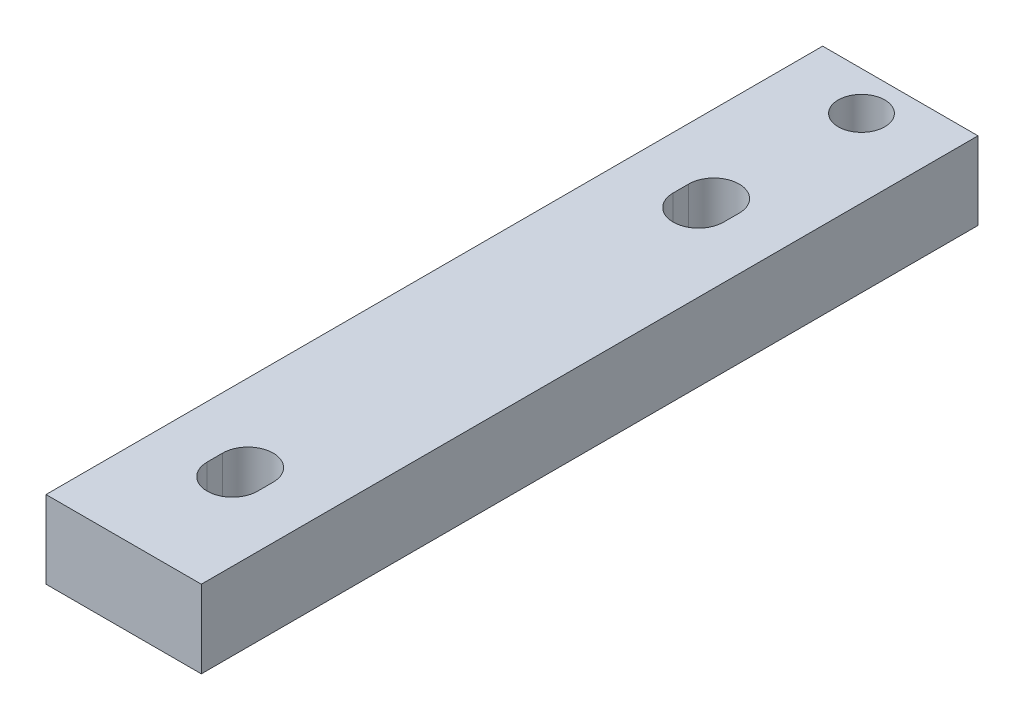
ISO-10303-21;
HEADER;
FILE_DESCRIPTION(('STEP AP214'),'2;1');
FILE_NAME('part.step','',(''),(''),'','','');
FILE_SCHEMA(('AUTOMOTIVE_DESIGN { 1 0 10303 214 1 1 1 1 }'));
ENDSEC;
DATA;
#1=APPLICATION_CONTEXT('core data for automotive mechanical design processes');
#2=APPLICATION_PROTOCOL_DEFINITION('international standard','automotive_design',2000,#1);
#3=PRODUCT_CONTEXT('',#1,'mechanical');
#4=PRODUCT('Part','Part','',(#3));
#5=PRODUCT_RELATED_PRODUCT_CATEGORY('part','',(#4));
#6=PRODUCT_DEFINITION_FORMATION('','',#4);
#7=PRODUCT_DEFINITION_CONTEXT('part definition',#1,'design');
#8=PRODUCT_DEFINITION('design','',#6,#7);
#9=PRODUCT_DEFINITION_SHAPE('','',#8);
#10=(LENGTH_UNIT() NAMED_UNIT(*) SI_UNIT(.MILLI.,.METRE.));
#11=(NAMED_UNIT(*) PLANE_ANGLE_UNIT() SI_UNIT($,.RADIAN.));
#12=(NAMED_UNIT(*) SI_UNIT($,.STERADIAN.) SOLID_ANGLE_UNIT());
#13=UNCERTAINTY_MEASURE_WITH_UNIT(LENGTH_MEASURE(1.E-05),#10,'distance_accuracy_value','');
#14=(GEOMETRIC_REPRESENTATION_CONTEXT(3) GLOBAL_UNCERTAINTY_ASSIGNED_CONTEXT((#13)) GLOBAL_UNIT_ASSIGNED_CONTEXT((#10,
#11,#12)) REPRESENTATION_CONTEXT('',''));
#15=CARTESIAN_POINT('',(0.,0.,0.));
#16=DIRECTION('',(0.,0.,1.));
#17=DIRECTION('',(1.,0.,0.));
#18=AXIS2_PLACEMENT_3D('',#15,#16,#17);
#19=CARTESIAN_POINT('',(0.,10.,0.));
#20=DIRECTION('',(0.,-1.,0.));
#21=DIRECTION('',(0.,0.,-1.));
#22=AXIS2_PLACEMENT_3D('',#19,#20,#21);
#23=PLANE('',#22);
#24=CARTESIAN_POINT('',(0.,10.,-24.));
#25=DIRECTION('',(0.,1.,0.));
#26=DIRECTION('',(0.,0.,1.));
#27=AXIS2_PLACEMENT_3D('',#24,#25,#26);
#28=CIRCLE('',#27,3.25);
#29=CARTESIAN_POINT('',(-3.25,10.,-24.));
#30=VERTEX_POINT('',#29);
#31=CARTESIAN_POINT('',(3.25,10.,-24.));
#32=VERTEX_POINT('',#31);
#33=EDGE_CURVE('E162',#30,#32,#28,.T.);
#34=ORIENTED_EDGE('',*,*,#33,.F.);
#35=DIRECTION('',(0.,0.,1.));
#36=VECTOR('',#35,1.);
#37=CARTESIAN_POINT('',(-3.25,10.,-24.));
#38=LINE('',#37,#36);
#39=CARTESIAN_POINT('',(-3.25,10.,-26.));
#40=VERTEX_POINT('',#39);
#41=EDGE_CURVE('E170',#40,#30,#38,.T.);
#42=ORIENTED_EDGE('',*,*,#41,.F.);
#43=CARTESIAN_POINT('',(0.,10.,-26.));
#44=DIRECTION('',(0.,1.,0.));
#45=DIRECTION('',(0.,0.,1.));
#46=AXIS2_PLACEMENT_3D('',#43,#44,#45);
#47=CIRCLE('',#46,3.25);
#48=CARTESIAN_POINT('',(3.25,10.,-26.));
#49=VERTEX_POINT('',#48);
#50=EDGE_CURVE('E167',#49,#40,#47,.T.);
#51=ORIENTED_EDGE('',*,*,#50,.F.);
#52=DIRECTION('',(0.,0.,-1.));
#53=VECTOR('',#52,1.);
#54=CARTESIAN_POINT('',(3.25,10.,-24.));
#55=LINE('',#54,#53);
#56=EDGE_CURVE('E164',#32,#49,#55,.T.);
#57=ORIENTED_EDGE('',*,*,#56,.F.);
#58=EDGE_LOOP('',(#34,#42,#51,#57));
#59=FACE_BOUND('',#58,.T.);
#60=DIRECTION('',(0.,0.,-1.));
#61=VECTOR('',#60,1.);
#62=CARTESIAN_POINT('',(10.,10.,50.));
#63=LINE('',#62,#61);
#64=CARTESIAN_POINT('',(10.,10.,50.));
#65=VERTEX_POINT('',#64);
#66=CARTESIAN_POINT('',(10.,10.,-50.));
#67=VERTEX_POINT('',#66);
#68=EDGE_CURVE('E199',#65,#67,#63,.T.);
#69=ORIENTED_EDGE('',*,*,#68,.T.);
#70=DIRECTION('',(-1.,0.,0.));
#71=VECTOR('',#70,1.);
#72=CARTESIAN_POINT('',(-10.,10.,-50.));
#73=LINE('',#72,#71);
#74=CARTESIAN_POINT('',(-10.,10.,-50.));
#75=VERTEX_POINT('',#74);
#76=EDGE_CURVE('E202',#67,#75,#73,.T.);
#77=ORIENTED_EDGE('',*,*,#76,.T.);
#78=DIRECTION('',(0.,0.,1.));
#79=VECTOR('',#78,1.);
#80=CARTESIAN_POINT('',(-10.,10.,50.));
#81=LINE('',#80,#79);
#82=CARTESIAN_POINT('',(-10.,10.,50.));
#83=VERTEX_POINT('',#82);
#84=EDGE_CURVE('E205',#75,#83,#81,.T.);
#85=ORIENTED_EDGE('',*,*,#84,.T.);
#86=DIRECTION('',(1.,0.,0.));
#87=VECTOR('',#86,1.);
#88=CARTESIAN_POINT('',(-10.,10.,50.));
#89=LINE('',#88,#87);
#90=EDGE_CURVE('E207',#83,#65,#89,.T.);
#91=ORIENTED_EDGE('',*,*,#90,.T.);
#92=EDGE_LOOP('',(#69,#77,#85,#91));
#93=FACE_BOUND('',#92,.T.);
#94=CARTESIAN_POINT('',(0.,10.,-45.));
#95=DIRECTION('',(0.,1.,0.));
#96=DIRECTION('',(0.,0.,1.));
#97=AXIS2_PLACEMENT_3D('',#94,#95,#96);
#98=CIRCLE('',#97,3.);
#99=CARTESIAN_POINT('',(0.,10.,-42.));
#100=VERTEX_POINT('',#99);
#101=EDGE_CURVE('E193',#100,#100,#98,.T.);
#102=ORIENTED_EDGE('',*,*,#101,.F.);
#103=EDGE_LOOP('',(#102));
#104=FACE_BOUND('',#103,.T.);
#105=CARTESIAN_POINT('',(0.,10.,36.));
#106=DIRECTION('',(0.,1.,0.));
#107=DIRECTION('',(0.,0.,1.));
#108=AXIS2_PLACEMENT_3D('',#105,#106,#107);
#109=CIRCLE('',#108,3.25);
#110=CARTESIAN_POINT('',(-3.25,10.,36.));
#111=VERTEX_POINT('',#110);
#112=CARTESIAN_POINT('',(3.25,10.,36.));
#113=VERTEX_POINT('',#112);
#114=EDGE_CURVE('E126',#111,#113,#109,.T.);
#115=ORIENTED_EDGE('',*,*,#114,.F.);
#116=DIRECTION('',(0.,0.,1.));
#117=VECTOR('',#116,1.);
#118=CARTESIAN_POINT('',(-3.25,10.,36.));
#119=LINE('',#118,#117);
#120=CARTESIAN_POINT('',(-3.25,10.,34.));
#121=VERTEX_POINT('',#120);
#122=EDGE_CURVE('E148',#121,#111,#119,.T.);
#123=ORIENTED_EDGE('',*,*,#122,.F.);
#124=CARTESIAN_POINT('',(0.,10.,34.));
#125=DIRECTION('',(0.,1.,0.));
#126=DIRECTION('',(0.,0.,1.));
#127=AXIS2_PLACEMENT_3D('',#124,#125,#126);
#128=CIRCLE('',#127,3.25);
#129=CARTESIAN_POINT('',(3.25,10.,34.));
#130=VERTEX_POINT('',#129);
#131=EDGE_CURVE('E146',#130,#121,#128,.T.);
#132=ORIENTED_EDGE('',*,*,#131,.F.);
#133=DIRECTION('',(0.,0.,-1.));
#134=VECTOR('',#133,1.);
#135=CARTESIAN_POINT('',(3.25,10.,36.));
#136=LINE('',#135,#134);
#137=EDGE_CURVE('E134',#113,#130,#136,.T.);
#138=ORIENTED_EDGE('',*,*,#137,.F.);
#139=EDGE_LOOP('',(#115,#123,#132,#138));
#140=FACE_BOUND('',#139,.T.);
#141=ADVANCED_FACE('F37',(#59,#93,#104,#140),#23,.F.);
#142=CARTESIAN_POINT('',(0.,0.,0.));
#143=DIRECTION('',(0.,-1.,0.));
#144=DIRECTION('',(0.,0.,-1.));
#145=AXIS2_PLACEMENT_3D('',#142,#143,#144);
#146=PLANE('',#145);
#147=DIRECTION('',(0.,0.,-1.));
#148=VECTOR('',#147,1.);
#149=CARTESIAN_POINT('',(10.,0.,50.));
#150=LINE('',#149,#148);
#151=CARTESIAN_POINT('',(10.,0.,50.));
#152=VERTEX_POINT('',#151);
#153=CARTESIAN_POINT('',(10.,0.,-50.));
#154=VERTEX_POINT('',#153);
#155=EDGE_CURVE('E196',#152,#154,#150,.T.);
#156=ORIENTED_EDGE('',*,*,#155,.F.);
#157=DIRECTION('',(1.,0.,0.));
#158=VECTOR('',#157,1.);
#159=CARTESIAN_POINT('',(-10.,0.,50.));
#160=LINE('',#159,#158);
#161=CARTESIAN_POINT('',(-10.,0.,50.));
#162=VERTEX_POINT('',#161);
#163=EDGE_CURVE('E203',#162,#152,#160,.T.);
#164=ORIENTED_EDGE('',*,*,#163,.F.);
#165=DIRECTION('',(0.,0.,1.));
#166=VECTOR('',#165,1.);
#167=CARTESIAN_POINT('',(-10.,0.,50.));
#168=LINE('',#167,#166);
#169=CARTESIAN_POINT('',(-10.,0.,-50.));
#170=VERTEX_POINT('',#169);
#171=EDGE_CURVE('E214',#170,#162,#168,.T.);
#172=ORIENTED_EDGE('',*,*,#171,.F.);
#173=DIRECTION('',(-1.,0.,0.));
#174=VECTOR('',#173,1.);
#175=CARTESIAN_POINT('',(-10.,0.,-50.));
#176=LINE('',#175,#174);
#177=EDGE_CURVE('E212',#154,#170,#176,.T.);
#178=ORIENTED_EDGE('',*,*,#177,.F.);
#179=EDGE_LOOP('',(#156,#164,#172,#178));
#180=FACE_BOUND('',#179,.T.);
#181=CARTESIAN_POINT('',(0.,0.,-45.));
#182=DIRECTION('',(0.,1.,0.));
#183=DIRECTION('',(0.,0.,1.));
#184=AXIS2_PLACEMENT_3D('',#181,#182,#183);
#185=CIRCLE('',#184,3.);
#186=CARTESIAN_POINT('',(0.,0.,-42.));
#187=VERTEX_POINT('',#186);
#188=EDGE_CURVE('E192',#187,#187,#185,.T.);
#189=ORIENTED_EDGE('',*,*,#188,.T.);
#190=EDGE_LOOP('',(#189));
#191=FACE_BOUND('',#190,.T.);
#192=DIRECTION('',(0.,0.,1.));
#193=VECTOR('',#192,1.);
#194=CARTESIAN_POINT('',(-3.25,0.,-24.));
#195=LINE('',#194,#193);
#196=CARTESIAN_POINT('',(-3.25,0.,-26.));
#197=VERTEX_POINT('',#196);
#198=CARTESIAN_POINT('',(-3.25,0.,-24.));
#199=VERTEX_POINT('',#198);
#200=EDGE_CURVE('E165',#197,#199,#195,.T.);
#201=ORIENTED_EDGE('',*,*,#200,.T.);
#202=CARTESIAN_POINT('',(0.,0.,-24.));
#203=DIRECTION('',(0.,1.,0.));
#204=DIRECTION('',(0.,0.,1.));
#205=AXIS2_PLACEMENT_3D('',#202,#203,#204);
#206=CIRCLE('',#205,3.25);
#207=CARTESIAN_POINT('',(3.25,0.,-24.));
#208=VERTEX_POINT('',#207);
#209=EDGE_CURVE('E142',#199,#208,#206,.T.);
#210=ORIENTED_EDGE('',*,*,#209,.T.);
#211=DIRECTION('',(0.,0.,-1.));
#212=VECTOR('',#211,1.);
#213=CARTESIAN_POINT('',(3.25,0.,-24.));
#214=LINE('',#213,#212);
#215=CARTESIAN_POINT('',(3.25,0.,-26.));
#216=VERTEX_POINT('',#215);
#217=EDGE_CURVE('E175',#208,#216,#214,.T.);
#218=ORIENTED_EDGE('',*,*,#217,.T.);
#219=CARTESIAN_POINT('',(0.,0.,-26.));
#220=DIRECTION('',(0.,1.,0.));
#221=DIRECTION('',(0.,0.,1.));
#222=AXIS2_PLACEMENT_3D('',#219,#220,#221);
#223=CIRCLE('',#222,3.25);
#224=EDGE_CURVE('E178',#216,#197,#223,.T.);
#225=ORIENTED_EDGE('',*,*,#224,.T.);
#226=EDGE_LOOP('',(#201,#210,#218,#225));
#227=FACE_BOUND('',#226,.T.);
#228=DIRECTION('',(0.,0.,1.));
#229=VECTOR('',#228,1.);
#230=CARTESIAN_POINT('',(-3.25,0.,36.));
#231=LINE('',#230,#229);
#232=CARTESIAN_POINT('',(-3.25,0.,34.));
#233=VERTEX_POINT('',#232);
#234=CARTESIAN_POINT('',(-3.25,0.,36.));
#235=VERTEX_POINT('',#234);
#236=EDGE_CURVE('E135',#233,#235,#231,.T.);
#237=ORIENTED_EDGE('',*,*,#236,.T.);
#238=CARTESIAN_POINT('',(0.,0.,36.));
#239=DIRECTION('',(0.,1.,0.));
#240=DIRECTION('',(0.,0.,1.));
#241=AXIS2_PLACEMENT_3D('',#238,#239,#240);
#242=CIRCLE('',#241,3.25);
#243=CARTESIAN_POINT('',(3.25,0.,36.));
#244=VERTEX_POINT('',#243);
#245=EDGE_CURVE('E60',#235,#244,#242,.T.);
#246=ORIENTED_EDGE('',*,*,#245,.T.);
#247=DIRECTION('',(0.,0.,-1.));
#248=VECTOR('',#247,1.);
#249=CARTESIAN_POINT('',(3.25,0.,36.));
#250=LINE('',#249,#248);
#251=CARTESIAN_POINT('',(3.25,0.,34.));
#252=VERTEX_POINT('',#251);
#253=EDGE_CURVE('E141',#244,#252,#250,.T.);
#254=ORIENTED_EDGE('',*,*,#253,.T.);
#255=CARTESIAN_POINT('',(0.,0.,34.));
#256=DIRECTION('',(0.,1.,0.));
#257=DIRECTION('',(0.,0.,1.));
#258=AXIS2_PLACEMENT_3D('',#255,#256,#257);
#259=CIRCLE('',#258,3.25);
#260=EDGE_CURVE('E154',#252,#233,#259,.T.);
#261=ORIENTED_EDGE('',*,*,#260,.T.);
#262=EDGE_LOOP('',(#237,#246,#254,#261));
#263=FACE_BOUND('',#262,.T.);
#264=ADVANCED_FACE('F232',(#180,#191,#227,#263),#146,.T.);
#265=CARTESIAN_POINT('',(10.,10.,50.));
#266=DIRECTION('',(-1.,0.,0.));
#267=DIRECTION('',(0.,0.,1.));
#268=AXIS2_PLACEMENT_3D('',#265,#266,#267);
#269=PLANE('',#268);
#270=ORIENTED_EDGE('',*,*,#155,.T.);
#271=DIRECTION('',(0.,-1.,0.));
#272=VECTOR('',#271,1.);
#273=CARTESIAN_POINT('',(10.,10.,-50.));
#274=LINE('',#273,#272);
#275=EDGE_CURVE('E11',#67,#154,#274,.T.);
#276=ORIENTED_EDGE('',*,*,#275,.F.);
#277=ORIENTED_EDGE('',*,*,#68,.F.);
#278=DIRECTION('',(0.,-1.,0.));
#279=VECTOR('',#278,1.);
#280=CARTESIAN_POINT('',(10.,10.,50.));
#281=LINE('',#280,#279);
#282=EDGE_CURVE('E209',#65,#152,#281,.T.);
#283=ORIENTED_EDGE('',*,*,#282,.T.);
#284=EDGE_LOOP('',(#270,#276,#277,#283));
#285=FACE_BOUND('',#284,.T.);
#286=ADVANCED_FACE('F39',(#285),#269,.F.);
#287=CARTESIAN_POINT('',(-10.,10.,-50.));
#288=DIRECTION('',(0.,0.,1.));
#289=DIRECTION('',(1.,0.,0.));
#290=AXIS2_PLACEMENT_3D('',#287,#288,#289);
#291=PLANE('',#290);
#292=ORIENTED_EDGE('',*,*,#177,.T.);
#293=DIRECTION('',(0.,-1.,0.));
#294=VECTOR('',#293,1.);
#295=CARTESIAN_POINT('',(-10.,10.,-50.));
#296=LINE('',#295,#294);
#297=EDGE_CURVE('E45',#75,#170,#296,.T.);
#298=ORIENTED_EDGE('',*,*,#297,.F.);
#299=ORIENTED_EDGE('',*,*,#76,.F.);
#300=ORIENTED_EDGE('',*,*,#275,.T.);
#301=EDGE_LOOP('',(#292,#298,#299,#300));
#302=FACE_BOUND('',#301,.T.);
#303=ADVANCED_FACE('F243',(#302),#291,.F.);
#304=CARTESIAN_POINT('',(-10.,10.,50.));
#305=DIRECTION('',(1.,0.,0.));
#306=DIRECTION('',(0.,0.,-1.));
#307=AXIS2_PLACEMENT_3D('',#304,#305,#306);
#308=PLANE('',#307);
#309=ORIENTED_EDGE('',*,*,#171,.T.);
#310=DIRECTION('',(0.,-1.,0.));
#311=VECTOR('',#310,1.);
#312=CARTESIAN_POINT('',(-10.,10.,50.));
#313=LINE('',#312,#311);
#314=EDGE_CURVE('E219',#83,#162,#313,.T.);
#315=ORIENTED_EDGE('',*,*,#314,.F.);
#316=ORIENTED_EDGE('',*,*,#84,.F.);
#317=ORIENTED_EDGE('',*,*,#297,.T.);
#318=EDGE_LOOP('',(#309,#315,#316,#317));
#319=FACE_BOUND('',#318,.T.);
#320=ADVANCED_FACE('F226',(#319),#308,.F.);
#321=CARTESIAN_POINT('',(-10.,10.,50.));
#322=DIRECTION('',(0.,0.,-1.));
#323=DIRECTION('',(-1.,0.,0.));
#324=AXIS2_PLACEMENT_3D('',#321,#322,#323);
#325=PLANE('',#324);
#326=ORIENTED_EDGE('',*,*,#163,.T.);
#327=ORIENTED_EDGE('',*,*,#282,.F.);
#328=ORIENTED_EDGE('',*,*,#90,.F.);
#329=ORIENTED_EDGE('',*,*,#314,.T.);
#330=EDGE_LOOP('',(#326,#327,#328,#329));
#331=FACE_BOUND('',#330,.T.);
#332=ADVANCED_FACE('F236',(#331),#325,.F.);
#333=CARTESIAN_POINT('',(0.,10.,-45.));
#334=DIRECTION('',(0.,-1.,0.));
#335=DIRECTION('',(0.,0.,-1.));
#336=AXIS2_PLACEMENT_3D('',#333,#334,#335);
#337=CYLINDRICAL_SURFACE('',#336,3.);
#338=ORIENTED_EDGE('',*,*,#101,.T.);
#339=EDGE_LOOP('',(#338));
#340=FACE_BOUND('',#339,.T.);
#341=ORIENTED_EDGE('',*,*,#188,.F.);
#342=EDGE_LOOP('',(#341));
#343=FACE_BOUND('',#342,.T.);
#344=ADVANCED_FACE('F259',(#340,#343),#337,.F.);
#345=CARTESIAN_POINT('',(0.,10.,-24.));
#346=DIRECTION('',(0.,-1.,0.));
#347=DIRECTION('',(0.,0.,-1.));
#348=AXIS2_PLACEMENT_3D('',#345,#346,#347);
#349=CYLINDRICAL_SURFACE('',#348,3.25);
#350=ORIENTED_EDGE('',*,*,#209,.F.);
#351=DIRECTION('',(0.,-1.,0.));
#352=VECTOR('',#351,1.);
#353=CARTESIAN_POINT('',(-3.25,10.,-24.));
#354=LINE('',#353,#352);
#355=EDGE_CURVE('E172',#30,#199,#354,.T.);
#356=ORIENTED_EDGE('',*,*,#355,.F.);
#357=ORIENTED_EDGE('',*,*,#33,.T.);
#358=DIRECTION('',(0.,-1.,0.));
#359=VECTOR('',#358,1.);
#360=CARTESIAN_POINT('',(3.25,10.,-24.));
#361=LINE('',#360,#359);
#362=EDGE_CURVE('E189',#32,#208,#361,.T.);
#363=ORIENTED_EDGE('',*,*,#362,.T.);
#364=EDGE_LOOP('',(#350,#356,#357,#363));
#365=FACE_BOUND('',#364,.T.);
#366=ADVANCED_FACE('F266',(#365),#349,.F.);
#367=CARTESIAN_POINT('',(3.25,10.,-24.));
#368=DIRECTION('',(-1.,0.,0.));
#369=DIRECTION('',(0.,0.,1.));
#370=AXIS2_PLACEMENT_3D('',#367,#368,#369);
#371=PLANE('',#370);
#372=ORIENTED_EDGE('',*,*,#217,.F.);
#373=ORIENTED_EDGE('',*,*,#362,.F.);
#374=ORIENTED_EDGE('',*,*,#56,.T.);
#375=DIRECTION('',(0.,-1.,0.));
#376=VECTOR('',#375,1.);
#377=CARTESIAN_POINT('',(3.25,10.,-26.));
#378=LINE('',#377,#376);
#379=EDGE_CURVE('E187',#49,#216,#378,.T.);
#380=ORIENTED_EDGE('',*,*,#379,.T.);
#381=EDGE_LOOP('',(#372,#373,#374,#380));
#382=FACE_BOUND('',#381,.T.);
#383=ADVANCED_FACE('F271',(#382),#371,.T.);
#384=CARTESIAN_POINT('',(0.,10.,-26.));
#385=DIRECTION('',(0.,-1.,0.));
#386=DIRECTION('',(0.,0.,-1.));
#387=AXIS2_PLACEMENT_3D('',#384,#385,#386);
#388=CYLINDRICAL_SURFACE('',#387,3.25);
#389=ORIENTED_EDGE('',*,*,#224,.F.);
#390=ORIENTED_EDGE('',*,*,#379,.F.);
#391=ORIENTED_EDGE('',*,*,#50,.T.);
#392=DIRECTION('',(0.,-1.,0.));
#393=VECTOR('',#392,1.);
#394=CARTESIAN_POINT('',(-3.25,10.,-26.));
#395=LINE('',#394,#393);
#396=EDGE_CURVE('E185',#40,#197,#395,.T.);
#397=ORIENTED_EDGE('',*,*,#396,.T.);
#398=EDGE_LOOP('',(#389,#390,#391,#397));
#399=FACE_BOUND('',#398,.T.);
#400=ADVANCED_FACE('F297',(#399),#388,.F.);
#401=CARTESIAN_POINT('',(-3.25,10.,-24.));
#402=DIRECTION('',(1.,0.,0.));
#403=DIRECTION('',(0.,0.,-1.));
#404=AXIS2_PLACEMENT_3D('',#401,#402,#403);
#405=PLANE('',#404);
#406=ORIENTED_EDGE('',*,*,#200,.F.);
#407=ORIENTED_EDGE('',*,*,#396,.F.);
#408=ORIENTED_EDGE('',*,*,#41,.T.);
#409=ORIENTED_EDGE('',*,*,#355,.T.);
#410=EDGE_LOOP('',(#406,#407,#408,#409));
#411=FACE_BOUND('',#410,.T.);
#412=ADVANCED_FACE('F294',(#411),#405,.T.);
#413=CARTESIAN_POINT('',(0.,10.,36.));
#414=DIRECTION('',(0.,-1.,0.));
#415=DIRECTION('',(0.,0.,-1.));
#416=AXIS2_PLACEMENT_3D('',#413,#414,#415);
#417=CYLINDRICAL_SURFACE('',#416,3.25);
#418=ORIENTED_EDGE('',*,*,#245,.F.);
#419=DIRECTION('',(0.,-1.,0.));
#420=VECTOR('',#419,1.);
#421=CARTESIAN_POINT('',(-3.25,10.,36.));
#422=LINE('',#421,#420);
#423=EDGE_CURVE('E130',#111,#235,#422,.T.);
#424=ORIENTED_EDGE('',*,*,#423,.F.);
#425=ORIENTED_EDGE('',*,*,#114,.T.);
#426=DIRECTION('',(0.,-1.,0.));
#427=VECTOR('',#426,1.);
#428=CARTESIAN_POINT('',(3.25,10.,36.));
#429=LINE('',#428,#427);
#430=EDGE_CURVE('E129',#113,#244,#429,.T.);
#431=ORIENTED_EDGE('',*,*,#430,.T.);
#432=EDGE_LOOP('',(#418,#424,#425,#431));
#433=FACE_BOUND('',#432,.T.);
#434=ADVANCED_FACE('F128',(#433),#417,.F.);
#435=CARTESIAN_POINT('',(3.25,10.,36.));
#436=DIRECTION('',(-1.,0.,0.));
#437=DIRECTION('',(0.,0.,1.));
#438=AXIS2_PLACEMENT_3D('',#435,#436,#437);
#439=PLANE('',#438);
#440=ORIENTED_EDGE('',*,*,#253,.F.);
#441=ORIENTED_EDGE('',*,*,#430,.F.);
#442=ORIENTED_EDGE('',*,*,#137,.T.);
#443=DIRECTION('',(0.,-1.,0.));
#444=VECTOR('',#443,1.);
#445=CARTESIAN_POINT('',(3.25,10.,34.));
#446=LINE('',#445,#444);
#447=EDGE_CURVE('E143',#130,#252,#446,.T.);
#448=ORIENTED_EDGE('',*,*,#447,.T.);
#449=EDGE_LOOP('',(#440,#441,#442,#448));
#450=FACE_BOUND('',#449,.T.);
#451=ADVANCED_FACE('F138',(#450),#439,.T.);
#452=CARTESIAN_POINT('',(0.,10.,34.));
#453=DIRECTION('',(0.,-1.,0.));
#454=DIRECTION('',(0.,0.,-1.));
#455=AXIS2_PLACEMENT_3D('',#452,#453,#454);
#456=CYLINDRICAL_SURFACE('',#455,3.25);
#457=ORIENTED_EDGE('',*,*,#260,.F.);
#458=ORIENTED_EDGE('',*,*,#447,.F.);
#459=ORIENTED_EDGE('',*,*,#131,.T.);
#460=DIRECTION('',(0.,-1.,0.));
#461=VECTOR('',#460,1.);
#462=CARTESIAN_POINT('',(-3.25,10.,34.));
#463=LINE('',#462,#461);
#464=EDGE_CURVE('E52',#121,#233,#463,.T.);
#465=ORIENTED_EDGE('',*,*,#464,.T.);
#466=EDGE_LOOP('',(#457,#458,#459,#465));
#467=FACE_BOUND('',#466,.T.);
#468=ADVANCED_FACE('F282',(#467),#456,.F.);
#469=CARTESIAN_POINT('',(-3.25,10.,36.));
#470=DIRECTION('',(1.,0.,0.));
#471=DIRECTION('',(0.,0.,-1.));
#472=AXIS2_PLACEMENT_3D('',#469,#470,#471);
#473=PLANE('',#472);
#474=ORIENTED_EDGE('',*,*,#236,.F.);
#475=ORIENTED_EDGE('',*,*,#464,.F.);
#476=ORIENTED_EDGE('',*,*,#122,.T.);
#477=ORIENTED_EDGE('',*,*,#423,.T.);
#478=EDGE_LOOP('',(#474,#475,#476,#477));
#479=FACE_BOUND('',#478,.T.);
#480=ADVANCED_FACE('F280',(#479),#473,.T.);
#481=CLOSED_SHELL('',(#141,#264,#286,#303,#320,#332,#344,#366,#383,#400,#412,#434,#451,#468,#480));
#482=MANIFOLD_SOLID_BREP('B2',#481);
#483=ADVANCED_BREP_SHAPE_REPRESENTATION('',(#18,#482),#14);
#484=SHAPE_DEFINITION_REPRESENTATION(#9,#483);
ENDSEC;
END-ISO-10303-21;
